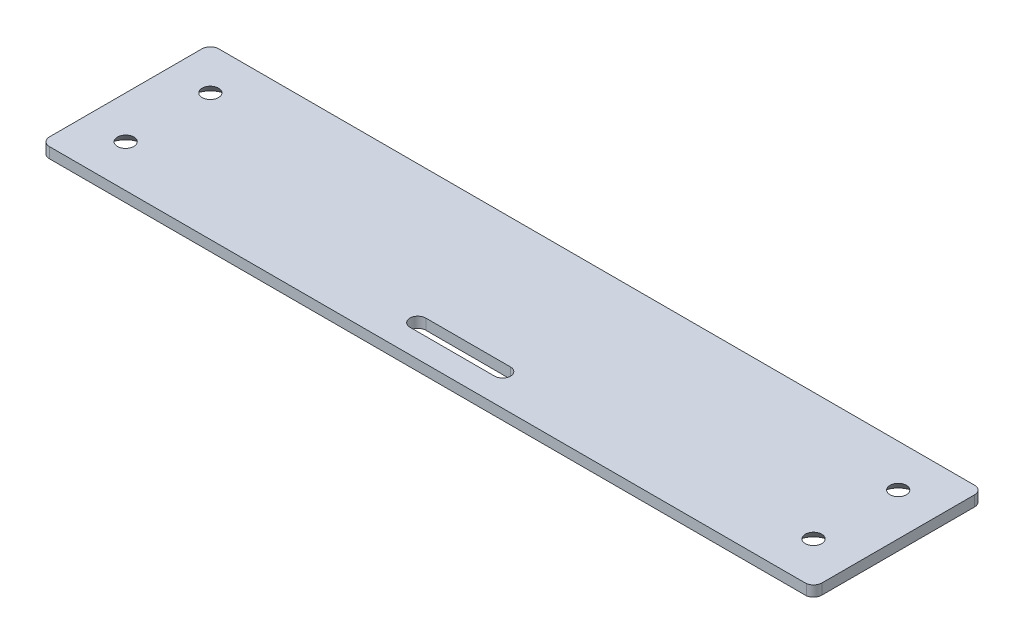
ISO-10303-21;
HEADER;
FILE_DESCRIPTION(('STEP AP214'),'2;1');
FILE_NAME('part.step','',(''),(''),'','','');
FILE_SCHEMA(('AUTOMOTIVE_DESIGN { 1 0 10303 214 1 1 1 1 }'));
ENDSEC;
DATA;
#1=APPLICATION_CONTEXT('core data for automotive mechanical design processes');
#2=APPLICATION_PROTOCOL_DEFINITION('international standard','automotive_design',2000,#1);
#3=PRODUCT_CONTEXT('',#1,'mechanical');
#4=PRODUCT('Part','Part','',(#3));
#5=PRODUCT_RELATED_PRODUCT_CATEGORY('part','',(#4));
#6=PRODUCT_DEFINITION_FORMATION('','',#4);
#7=PRODUCT_DEFINITION_CONTEXT('part definition',#1,'design');
#8=PRODUCT_DEFINITION('design','',#6,#7);
#9=PRODUCT_DEFINITION_SHAPE('','',#8);
#10=(LENGTH_UNIT() NAMED_UNIT(*) SI_UNIT(.MILLI.,.METRE.));
#11=(NAMED_UNIT(*) PLANE_ANGLE_UNIT() SI_UNIT($,.RADIAN.));
#12=(NAMED_UNIT(*) SI_UNIT($,.STERADIAN.) SOLID_ANGLE_UNIT());
#13=UNCERTAINTY_MEASURE_WITH_UNIT(LENGTH_MEASURE(1.E-05),#10,'distance_accuracy_value','');
#14=(GEOMETRIC_REPRESENTATION_CONTEXT(3) GLOBAL_UNCERTAINTY_ASSIGNED_CONTEXT((#13)) GLOBAL_UNIT_ASSIGNED_CONTEXT((#10,
#11,#12)) REPRESENTATION_CONTEXT('',''));
#15=CARTESIAN_POINT('',(0.,0.,0.));
#16=DIRECTION('',(0.,0.,1.));
#17=DIRECTION('',(1.,0.,0.));
#18=AXIS2_PLACEMENT_3D('',#15,#16,#17);
#19=CARTESIAN_POINT('',(-204.92552873815,3.175,173.764846249872));
#20=DIRECTION('',(0.,1.,0.));
#21=DIRECTION('',(0.,0.,1.));
#22=AXIS2_PLACEMENT_3D('',#19,#20,#21);
#23=PLANE('',#22);
#24=CARTESIAN_POINT('',(-103.922128749303,3.175,166.779846249872));
#25=DIRECTION('',(0.,-1.,0.));
#26=DIRECTION('',(0.,0.,-1.));
#27=AXIS2_PLACEMENT_3D('',#24,#25,#26);
#28=CIRCLE('',#27,2.38759999999999);
#29=CARTESIAN_POINT('',(-103.922128749303,3.175,169.167446249872));
#30=VERTEX_POINT('',#29);
#31=CARTESIAN_POINT('',(-103.922128749303,3.175,164.392246249872));
#32=VERTEX_POINT('',#31);
#33=EDGE_CURVE('E127',#30,#32,#28,.T.);
#34=ORIENTED_EDGE('',*,*,#33,.T.);
#35=DIRECTION('',(1.,0.,0.));
#36=VECTOR('',#35,1.);
#37=CARTESIAN_POINT('',(-103.922128749303,3.175,164.392246249872));
#38=LINE('',#37,#36);
#39=CARTESIAN_POINT('',(-78.5221287493033,3.175,164.392246249872));
#40=VERTEX_POINT('',#39);
#41=EDGE_CURVE('E136',#32,#40,#38,.T.);
#42=ORIENTED_EDGE('',*,*,#41,.T.);
#43=CARTESIAN_POINT('',(-78.5221287493033,3.175,166.779846249872));
#44=DIRECTION('',(0.,-1.,0.));
#45=DIRECTION('',(0.,0.,1.));
#46=AXIS2_PLACEMENT_3D('',#43,#44,#45);
#47=CIRCLE('',#46,2.38759999999999);
#48=CARTESIAN_POINT('',(-78.5221287493033,3.175,169.167446249872));
#49=VERTEX_POINT('',#48);
#50=EDGE_CURVE('E51',#40,#49,#47,.T.);
#51=ORIENTED_EDGE('',*,*,#50,.T.);
#52=DIRECTION('',(-1.,0.,0.));
#53=VECTOR('',#52,1.);
#54=CARTESIAN_POINT('',(-78.5221287493033,3.175,169.167446249872));
#55=LINE('',#54,#53);
#56=EDGE_CURVE('E133',#49,#30,#55,.T.);
#57=ORIENTED_EDGE('',*,*,#56,.T.);
#58=EDGE_LOOP('',(#34,#42,#51,#57));
#59=FACE_BOUND('',#58,.T.);
#60=CARTESIAN_POINT('',(11.6094712618503,3.175,163.604846249872));
#61=DIRECTION('',(0.,1.,0.));
#62=DIRECTION('',(0.,0.,1.));
#63=AXIS2_PLACEMENT_3D('',#60,#61,#62);
#64=CIRCLE('',#63,2.45971460743348);
#65=CARTESIAN_POINT('',(11.6094712618503,3.175,166.064560857305));
#66=VERTEX_POINT('',#65);
#67=EDGE_CURVE('E163',#66,#66,#64,.T.);
#68=ORIENTED_EDGE('',*,*,#67,.F.);
#69=EDGE_LOOP('',(#68));
#70=FACE_BOUND('',#69,.T.);
#71=CARTESIAN_POINT('',(-204.92552873815,3.175,173.764846249872));
#72=DIRECTION('',(0.,1.,0.));
#73=DIRECTION('',(0.,0.,1.));
#74=AXIS2_PLACEMENT_3D('',#71,#72,#73);
#75=CIRCLE('',#74,2.54);
#76=CARTESIAN_POINT('',(-207.46552873815,3.175,173.764846249872));
#77=VERTEX_POINT('',#76);
#78=CARTESIAN_POINT('',(-204.92552873815,3.175,176.304846249872));
#79=VERTEX_POINT('',#78);
#80=EDGE_CURVE('E185',#77,#79,#75,.T.);
#81=ORIENTED_EDGE('',*,*,#80,.T.);
#82=DIRECTION('',(1.,0.,0.));
#83=VECTOR('',#82,1.);
#84=CARTESIAN_POINT('',(-204.92552873815,3.175,176.304846249872));
#85=LINE('',#84,#83);
#86=CARTESIAN_POINT('',(22.1253664444665,3.175,176.304846249872));
#87=VERTEX_POINT('',#86);
#88=EDGE_CURVE('E188',#79,#87,#85,.T.);
#89=ORIENTED_EDGE('',*,*,#88,.T.);
#90=CARTESIAN_POINT('',(21.7694712618503,3.175,173.78990318511));
#91=DIRECTION('',(0.,1.,0.));
#92=DIRECTION('',(0.,0.,1.));
#93=AXIS2_PLACEMENT_3D('',#90,#91,#92);
#94=CIRCLE('',#93,2.54);
#95=CARTESIAN_POINT('',(24.3094712618503,3.175,173.78990318511));
#96=VERTEX_POINT('',#95);
#97=EDGE_CURVE('E191',#87,#96,#94,.T.);
#98=ORIENTED_EDGE('',*,*,#97,.T.);
#99=DIRECTION('',(0.,0.,-1.));
#100=VECTOR('',#99,1.);
#101=CARTESIAN_POINT('',(24.3094712618503,3.175,173.78990318511));
#102=LINE('',#101,#100);
#103=CARTESIAN_POINT('',(24.3094712618503,3.175,128.019789314633));
#104=VERTEX_POINT('',#103);
#105=EDGE_CURVE('E193',#96,#104,#102,.T.);
#106=ORIENTED_EDGE('',*,*,#105,.T.);
#107=CARTESIAN_POINT('',(21.7694712618503,3.175,128.019789314633));
#108=DIRECTION('',(0.,1.,0.));
#109=DIRECTION('',(0.,0.,-1.));
#110=AXIS2_PLACEMENT_3D('',#107,#108,#109);
#111=CIRCLE('',#110,2.54);
#112=CARTESIAN_POINT('',(22.1253664444665,3.175,125.504846249872));
#113=VERTEX_POINT('',#112);
#114=EDGE_CURVE('E195',#104,#113,#111,.T.);
#115=ORIENTED_EDGE('',*,*,#114,.T.);
#116=DIRECTION('',(-1.,0.,0.));
#117=VECTOR('',#116,1.);
#118=CARTESIAN_POINT('',(22.1253664444665,3.175,125.504846249872));
#119=LINE('',#118,#117);
#120=CARTESIAN_POINT('',(-204.92552873815,3.175,125.504846249872));
#121=VERTEX_POINT('',#120);
#122=EDGE_CURVE('E197',#113,#121,#119,.T.);
#123=ORIENTED_EDGE('',*,*,#122,.T.);
#124=CARTESIAN_POINT('',(-204.92552873815,3.175,128.044846249872));
#125=DIRECTION('',(0.,1.,0.));
#126=DIRECTION('',(0.,0.,-1.));
#127=AXIS2_PLACEMENT_3D('',#124,#125,#126);
#128=CIRCLE('',#127,2.53999999999997);
#129=CARTESIAN_POINT('',(-207.46552873815,3.175,128.044846249872));
#130=VERTEX_POINT('',#129);
#131=EDGE_CURVE('E199',#121,#130,#128,.T.);
#132=ORIENTED_EDGE('',*,*,#131,.T.);
#133=DIRECTION('',(0.,0.,1.));
#134=VECTOR('',#133,1.);
#135=CARTESIAN_POINT('',(-207.46552873815,3.175,128.044846249872));
#136=LINE('',#135,#134);
#137=EDGE_CURVE('E201',#130,#77,#136,.T.);
#138=ORIENTED_EDGE('',*,*,#137,.T.);
#139=EDGE_LOOP('',(#81,#89,#98,#106,#115,#123,#132,#138));
#140=FACE_BOUND('',#139,.T.);
#141=CARTESIAN_POINT('',(-194.76552873815,3.175,163.604846249872));
#142=DIRECTION('',(0.,1.,0.));
#143=DIRECTION('',(0.,0.,1.));
#144=AXIS2_PLACEMENT_3D('',#141,#142,#143);
#145=CIRCLE('',#144,2.45971460743348);
#146=CARTESIAN_POINT('',(-194.76552873815,3.175,166.064560857305));
#147=VERTEX_POINT('',#146);
#148=EDGE_CURVE('E181',#147,#147,#145,.T.);
#149=ORIENTED_EDGE('',*,*,#148,.F.);
#150=EDGE_LOOP('',(#149));
#151=FACE_BOUND('',#150,.T.);
#152=CARTESIAN_POINT('',(-194.76552873815,3.175,138.204846249872));
#153=DIRECTION('',(0.,1.,0.));
#154=DIRECTION('',(0.,0.,1.));
#155=AXIS2_PLACEMENT_3D('',#152,#153,#154);
#156=CIRCLE('',#155,2.45971460743348);
#157=CARTESIAN_POINT('',(-194.76552873815,3.175,140.664560857305));
#158=VERTEX_POINT('',#157);
#159=EDGE_CURVE('E175',#158,#158,#156,.T.);
#160=ORIENTED_EDGE('',*,*,#159,.F.);
#161=EDGE_LOOP('',(#160));
#162=FACE_BOUND('',#161,.T.);
#163=CARTESIAN_POINT('',(11.6094712618503,3.175,138.204846249872));
#164=DIRECTION('',(0.,1.,0.));
#165=DIRECTION('',(0.,0.,1.));
#166=AXIS2_PLACEMENT_3D('',#163,#164,#165);
#167=CIRCLE('',#166,2.45971460743348);
#168=CARTESIAN_POINT('',(11.6094712618503,3.175,140.664560857305));
#169=VERTEX_POINT('',#168);
#170=EDGE_CURVE('E169',#169,#169,#167,.T.);
#171=ORIENTED_EDGE('',*,*,#170,.F.);
#172=EDGE_LOOP('',(#171));
#173=FACE_BOUND('',#172,.T.);
#174=ADVANCED_FACE('F36',(#59,#70,#140,#151,#162,#173),#23,.T.);
#175=CARTESIAN_POINT('',(-204.92552873815,3.175,173.764846249872));
#176=DIRECTION('',(0.,-1.,0.));
#177=DIRECTION('',(0.,0.,-1.));
#178=AXIS2_PLACEMENT_3D('',#175,#176,#177);
#179=CYLINDRICAL_SURFACE('',#178,2.54);
#180=CARTESIAN_POINT('',(-204.92552873815,0.,173.764846249872));
#181=DIRECTION('',(0.,1.,0.));
#182=DIRECTION('',(0.,0.,1.));
#183=AXIS2_PLACEMENT_3D('',#180,#181,#182);
#184=CIRCLE('',#183,2.54);
#185=CARTESIAN_POINT('',(-207.46552873815,0.,173.764846249872));
#186=VERTEX_POINT('',#185);
#187=CARTESIAN_POINT('',(-204.92552873815,0.,176.304846249872));
#188=VERTEX_POINT('',#187);
#189=EDGE_CURVE('E184',#186,#188,#184,.T.);
#190=ORIENTED_EDGE('',*,*,#189,.T.);
#191=DIRECTION('',(0.,-1.,0.));
#192=VECTOR('',#191,1.);
#193=CARTESIAN_POINT('',(-204.92552873815,3.175,176.304846249872));
#194=LINE('',#193,#192);
#195=EDGE_CURVE('E11',#79,#188,#194,.T.);
#196=ORIENTED_EDGE('',*,*,#195,.F.);
#197=ORIENTED_EDGE('',*,*,#80,.F.);
#198=DIRECTION('',(0.,-1.,0.));
#199=VECTOR('',#198,1.);
#200=CARTESIAN_POINT('',(-207.46552873815,3.175,173.764846249872));
#201=LINE('',#200,#199);
#202=EDGE_CURVE('E203',#77,#186,#201,.T.);
#203=ORIENTED_EDGE('',*,*,#202,.T.);
#204=EDGE_LOOP('',(#190,#196,#197,#203));
#205=FACE_BOUND('',#204,.T.);
#206=ADVANCED_FACE('F38',(#205),#179,.T.);
#207=CARTESIAN_POINT('',(-204.92552873815,3.175,176.304846249872));
#208=DIRECTION('',(0.,0.,-1.));
#209=DIRECTION('',(-1.,0.,0.));
#210=AXIS2_PLACEMENT_3D('',#207,#208,#209);
#211=PLANE('',#210);
#212=DIRECTION('',(1.,0.,0.));
#213=VECTOR('',#212,1.);
#214=CARTESIAN_POINT('',(-204.92552873815,0.,176.304846249872));
#215=LINE('',#214,#213);
#216=CARTESIAN_POINT('',(22.1253664444665,0.,176.304846249872));
#217=VERTEX_POINT('',#216);
#218=EDGE_CURVE('E206',#188,#217,#215,.T.);
#219=ORIENTED_EDGE('',*,*,#218,.T.);
#220=DIRECTION('',(0.,-1.,0.));
#221=VECTOR('',#220,1.);
#222=CARTESIAN_POINT('',(22.1253664444665,3.175,176.304846249872));
#223=LINE('',#222,#221);
#224=EDGE_CURVE('E44',#87,#217,#223,.T.);
#225=ORIENTED_EDGE('',*,*,#224,.F.);
#226=ORIENTED_EDGE('',*,*,#88,.F.);
#227=ORIENTED_EDGE('',*,*,#195,.T.);
#228=EDGE_LOOP('',(#219,#225,#226,#227));
#229=FACE_BOUND('',#228,.T.);
#230=ADVANCED_FACE('F263',(#229),#211,.F.);
#231=CARTESIAN_POINT('',(21.7694712618503,3.175,173.78990318511));
#232=DIRECTION('',(0.,-1.,0.));
#233=DIRECTION('',(0.,0.,-1.));
#234=AXIS2_PLACEMENT_3D('',#231,#232,#233);
#235=CYLINDRICAL_SURFACE('',#234,2.54);
#236=CARTESIAN_POINT('',(21.7694712618503,0.,173.78990318511));
#237=DIRECTION('',(0.,1.,0.));
#238=DIRECTION('',(0.,0.,1.));
#239=AXIS2_PLACEMENT_3D('',#236,#237,#238);
#240=CIRCLE('',#239,2.54);
#241=CARTESIAN_POINT('',(24.3094712618503,0.,173.78990318511));
#242=VERTEX_POINT('',#241);
#243=EDGE_CURVE('E208',#217,#242,#240,.T.);
#244=ORIENTED_EDGE('',*,*,#243,.T.);
#245=DIRECTION('',(0.,-1.,0.));
#246=VECTOR('',#245,1.);
#247=CARTESIAN_POINT('',(24.3094712618503,3.175,173.78990318511));
#248=LINE('',#247,#246);
#249=EDGE_CURVE('E233',#96,#242,#248,.T.);
#250=ORIENTED_EDGE('',*,*,#249,.F.);
#251=ORIENTED_EDGE('',*,*,#97,.F.);
#252=ORIENTED_EDGE('',*,*,#224,.T.);
#253=EDGE_LOOP('',(#244,#250,#251,#252));
#254=FACE_BOUND('',#253,.T.);
#255=ADVANCED_FACE('F240',(#254),#235,.T.);
#256=CARTESIAN_POINT('',(24.3094712618503,3.175,173.78990318511));
#257=DIRECTION('',(-1.,0.,0.));
#258=DIRECTION('',(0.,0.,1.));
#259=AXIS2_PLACEMENT_3D('',#256,#257,#258);
#260=PLANE('',#259);
#261=DIRECTION('',(0.,0.,-1.));
#262=VECTOR('',#261,1.);
#263=CARTESIAN_POINT('',(24.3094712618503,0.,173.78990318511));
#264=LINE('',#263,#262);
#265=CARTESIAN_POINT('',(24.3094712618503,0.,128.019789314633));
#266=VERTEX_POINT('',#265);
#267=EDGE_CURVE('E210',#242,#266,#264,.T.);
#268=ORIENTED_EDGE('',*,*,#267,.T.);
#269=DIRECTION('',(0.,-1.,0.));
#270=VECTOR('',#269,1.);
#271=CARTESIAN_POINT('',(24.3094712618503,3.175,128.019789314633));
#272=LINE('',#271,#270);
#273=EDGE_CURVE('E230',#104,#266,#272,.T.);
#274=ORIENTED_EDGE('',*,*,#273,.F.);
#275=ORIENTED_EDGE('',*,*,#105,.F.);
#276=ORIENTED_EDGE('',*,*,#249,.T.);
#277=EDGE_LOOP('',(#268,#274,#275,#276));
#278=FACE_BOUND('',#277,.T.);
#279=ADVANCED_FACE('F251',(#278),#260,.F.);
#280=CARTESIAN_POINT('',(21.7694712618503,3.175,128.019789314633));
#281=DIRECTION('',(0.,-1.,0.));
#282=DIRECTION('',(0.,0.,-1.));
#283=AXIS2_PLACEMENT_3D('',#280,#281,#282);
#284=CYLINDRICAL_SURFACE('',#283,2.54);
#285=CARTESIAN_POINT('',(21.7694712618503,0.,128.019789314633));
#286=DIRECTION('',(0.,1.,0.));
#287=DIRECTION('',(0.,0.,-1.));
#288=AXIS2_PLACEMENT_3D('',#285,#286,#287);
#289=CIRCLE('',#288,2.54);
#290=CARTESIAN_POINT('',(22.1253664444665,0.,125.504846249872));
#291=VERTEX_POINT('',#290);
#292=EDGE_CURVE('E212',#266,#291,#289,.T.);
#293=ORIENTED_EDGE('',*,*,#292,.T.);
#294=DIRECTION('',(0.,-1.,0.));
#295=VECTOR('',#294,1.);
#296=CARTESIAN_POINT('',(22.1253664444665,3.175,125.504846249872));
#297=LINE('',#296,#295);
#298=EDGE_CURVE('E227',#113,#291,#297,.T.);
#299=ORIENTED_EDGE('',*,*,#298,.F.);
#300=ORIENTED_EDGE('',*,*,#114,.F.);
#301=ORIENTED_EDGE('',*,*,#273,.T.);
#302=EDGE_LOOP('',(#293,#299,#300,#301));
#303=FACE_BOUND('',#302,.T.);
#304=ADVANCED_FACE('F255',(#303),#284,.T.);
#305=CARTESIAN_POINT('',(22.1253664444665,3.175,125.504846249872));
#306=DIRECTION('',(0.,0.,1.));
#307=DIRECTION('',(1.,0.,0.));
#308=AXIS2_PLACEMENT_3D('',#305,#306,#307);
#309=PLANE('',#308);
#310=DIRECTION('',(-1.,0.,0.));
#311=VECTOR('',#310,1.);
#312=CARTESIAN_POINT('',(22.1253664444665,0.,125.504846249872));
#313=LINE('',#312,#311);
#314=CARTESIAN_POINT('',(-204.92552873815,0.,125.504846249872));
#315=VERTEX_POINT('',#314);
#316=EDGE_CURVE('E214',#291,#315,#313,.T.);
#317=ORIENTED_EDGE('',*,*,#316,.T.);
#318=DIRECTION('',(0.,-1.,0.));
#319=VECTOR('',#318,1.);
#320=CARTESIAN_POINT('',(-204.92552873815,3.175,125.504846249872));
#321=LINE('',#320,#319);
#322=EDGE_CURVE('E224',#121,#315,#321,.T.);
#323=ORIENTED_EDGE('',*,*,#322,.F.);
#324=ORIENTED_EDGE('',*,*,#122,.F.);
#325=ORIENTED_EDGE('',*,*,#298,.T.);
#326=EDGE_LOOP('',(#317,#323,#324,#325));
#327=FACE_BOUND('',#326,.T.);
#328=ADVANCED_FACE('F276',(#327),#309,.F.);
#329=CARTESIAN_POINT('',(-204.92552873815,3.175,128.044846249872));
#330=DIRECTION('',(0.,-1.,0.));
#331=DIRECTION('',(0.,0.,-1.));
#332=AXIS2_PLACEMENT_3D('',#329,#330,#331);
#333=CYLINDRICAL_SURFACE('',#332,2.53999999999997);
#334=CARTESIAN_POINT('',(-204.92552873815,0.,128.044846249872));
#335=DIRECTION('',(0.,1.,0.));
#336=DIRECTION('',(0.,0.,-1.));
#337=AXIS2_PLACEMENT_3D('',#334,#335,#336);
#338=CIRCLE('',#337,2.53999999999997);
#339=CARTESIAN_POINT('',(-207.46552873815,0.,128.044846249872));
#340=VERTEX_POINT('',#339);
#341=EDGE_CURVE('E216',#315,#340,#338,.T.);
#342=ORIENTED_EDGE('',*,*,#341,.T.);
#343=DIRECTION('',(0.,-1.,0.));
#344=VECTOR('',#343,1.);
#345=CARTESIAN_POINT('',(-207.46552873815,3.175,128.044846249872));
#346=LINE('',#345,#344);
#347=EDGE_CURVE('E221',#130,#340,#346,.T.);
#348=ORIENTED_EDGE('',*,*,#347,.F.);
#349=ORIENTED_EDGE('',*,*,#131,.F.);
#350=ORIENTED_EDGE('',*,*,#322,.T.);
#351=EDGE_LOOP('',(#342,#348,#349,#350));
#352=FACE_BOUND('',#351,.T.);
#353=ADVANCED_FACE('F274',(#352),#333,.T.);
#354=CARTESIAN_POINT('',(-207.46552873815,3.175,128.044846249872));
#355=DIRECTION('',(1.,0.,0.));
#356=DIRECTION('',(0.,0.,-1.));
#357=AXIS2_PLACEMENT_3D('',#354,#355,#356);
#358=PLANE('',#357);
#359=DIRECTION('',(0.,0.,1.));
#360=VECTOR('',#359,1.);
#361=CARTESIAN_POINT('',(-207.46552873815,0.,128.044846249872));
#362=LINE('',#361,#360);
#363=EDGE_CURVE('E189',#340,#186,#362,.T.);
#364=ORIENTED_EDGE('',*,*,#363,.T.);
#365=ORIENTED_EDGE('',*,*,#202,.F.);
#366=ORIENTED_EDGE('',*,*,#137,.F.);
#367=ORIENTED_EDGE('',*,*,#347,.T.);
#368=EDGE_LOOP('',(#364,#365,#366,#367));
#369=FACE_BOUND('',#368,.T.);
#370=ADVANCED_FACE('F269',(#369),#358,.F.);
#371=CARTESIAN_POINT('',(-204.92552873815,0.,173.764846249872));
#372=DIRECTION('',(0.,1.,0.));
#373=DIRECTION('',(0.,0.,1.));
#374=AXIS2_PLACEMENT_3D('',#371,#372,#373);
#375=PLANE('',#374);
#376=DIRECTION('',(1.,0.,0.));
#377=VECTOR('',#376,1.);
#378=CARTESIAN_POINT('',(-103.922128749303,0.,164.392246249872));
#379=LINE('',#378,#377);
#380=CARTESIAN_POINT('',(-103.922128749303,0.,164.392246249872));
#381=VERTEX_POINT('',#380);
#382=CARTESIAN_POINT('',(-78.5221287493033,0.,164.392246249872));
#383=VERTEX_POINT('',#382);
#384=EDGE_CURVE('E151',#381,#383,#379,.T.);
#385=ORIENTED_EDGE('',*,*,#384,.F.);
#386=CARTESIAN_POINT('',(-103.922128749303,0.,166.779846249872));
#387=DIRECTION('',(0.,-1.,0.));
#388=DIRECTION('',(0.,0.,-1.));
#389=AXIS2_PLACEMENT_3D('',#386,#387,#388);
#390=CIRCLE('',#389,2.38759999999999);
#391=CARTESIAN_POINT('',(-103.922128749303,0.,169.167446249872));
#392=VERTEX_POINT('',#391);
#393=EDGE_CURVE('E59',#392,#381,#390,.T.);
#394=ORIENTED_EDGE('',*,*,#393,.F.);
#395=DIRECTION('',(-1.,0.,0.));
#396=VECTOR('',#395,1.);
#397=CARTESIAN_POINT('',(-78.5221287493033,0.,169.167446249872));
#398=LINE('',#397,#396);
#399=CARTESIAN_POINT('',(-78.5221287493033,0.,169.167446249872));
#400=VERTEX_POINT('',#399);
#401=EDGE_CURVE('E142',#400,#392,#398,.T.);
#402=ORIENTED_EDGE('',*,*,#401,.F.);
#403=CARTESIAN_POINT('',(-78.5221287493033,0.,166.779846249872));
#404=DIRECTION('',(0.,-1.,0.));
#405=DIRECTION('',(0.,0.,1.));
#406=AXIS2_PLACEMENT_3D('',#403,#404,#405);
#407=CIRCLE('',#406,2.38759999999999);
#408=EDGE_CURVE('E145',#383,#400,#407,.T.);
#409=ORIENTED_EDGE('',*,*,#408,.F.);
#410=EDGE_LOOP('',(#385,#394,#402,#409));
#411=FACE_BOUND('',#410,.T.);
#412=CARTESIAN_POINT('',(11.6094712618503,0.,163.604846249872));
#413=DIRECTION('',(0.,-1.,0.));
#414=DIRECTION('',(0.,0.,-1.));
#415=AXIS2_PLACEMENT_3D('',#412,#413,#414);
#416=CIRCLE('',#415,5.2197);
#417=CARTESIAN_POINT('',(11.6094712618503,0.,158.385146249872));
#418=VERTEX_POINT('',#417);
#419=EDGE_CURVE('E157',#418,#418,#416,.T.);
#420=ORIENTED_EDGE('',*,*,#419,.F.);
#421=EDGE_LOOP('',(#420));
#422=FACE_BOUND('',#421,.T.);
#423=CARTESIAN_POINT('',(11.6094712618503,0.,138.204846249872));
#424=DIRECTION('',(0.,-1.,0.));
#425=DIRECTION('',(0.,0.,-1.));
#426=AXIS2_PLACEMENT_3D('',#423,#424,#425);
#427=CIRCLE('',#426,5.2197);
#428=CARTESIAN_POINT('',(11.6094712618503,0.,132.985146249872));
#429=VERTEX_POINT('',#428);
#430=EDGE_CURVE('E166',#429,#429,#427,.T.);
#431=ORIENTED_EDGE('',*,*,#430,.F.);
#432=EDGE_LOOP('',(#431));
#433=FACE_BOUND('',#432,.T.);
#434=CARTESIAN_POINT('',(-194.76552873815,0.,138.204846249872));
#435=DIRECTION('',(0.,-1.,0.));
#436=DIRECTION('',(0.,0.,-1.));
#437=AXIS2_PLACEMENT_3D('',#434,#435,#436);
#438=CIRCLE('',#437,5.21969999999999);
#439=CARTESIAN_POINT('',(-194.76552873815,0.,132.985146249872));
#440=VERTEX_POINT('',#439);
#441=EDGE_CURVE('E172',#440,#440,#438,.T.);
#442=ORIENTED_EDGE('',*,*,#441,.F.);
#443=EDGE_LOOP('',(#442));
#444=FACE_BOUND('',#443,.T.);
#445=CARTESIAN_POINT('',(-194.76552873815,0.,163.604846249872));
#446=DIRECTION('',(0.,-1.,0.));
#447=DIRECTION('',(0.,0.,-1.));
#448=AXIS2_PLACEMENT_3D('',#445,#446,#447);
#449=CIRCLE('',#448,5.21969999999999);
#450=CARTESIAN_POINT('',(-194.76552873815,0.,158.385146249872));
#451=VERTEX_POINT('',#450);
#452=EDGE_CURVE('E178',#451,#451,#449,.T.);
#453=ORIENTED_EDGE('',*,*,#452,.F.);
#454=EDGE_LOOP('',(#453));
#455=FACE_BOUND('',#454,.T.);
#456=ORIENTED_EDGE('',*,*,#189,.F.);
#457=ORIENTED_EDGE('',*,*,#363,.F.);
#458=ORIENTED_EDGE('',*,*,#341,.F.);
#459=ORIENTED_EDGE('',*,*,#316,.F.);
#460=ORIENTED_EDGE('',*,*,#292,.F.);
#461=ORIENTED_EDGE('',*,*,#267,.F.);
#462=ORIENTED_EDGE('',*,*,#243,.F.);
#463=ORIENTED_EDGE('',*,*,#218,.F.);
#464=EDGE_LOOP('',(#456,#457,#458,#459,#460,#461,#462,#463));
#465=FACE_BOUND('',#464,.T.);
#466=ADVANCED_FACE('F246',(#411,#422,#433,#444,#455,#465),#375,.F.);
#467=CARTESIAN_POINT('',(-194.76552873815,0.,163.604846249872));
#468=DIRECTION('',(0.,-1.,0.));
#469=DIRECTION('',(0.,0.,-1.));
#470=AXIS2_PLACEMENT_3D('',#467,#468,#469);
#471=CONICAL_SURFACE('',#470,5.21969999999999,0.715584993317674);
#472=ORIENTED_EDGE('',*,*,#148,.T.);
#473=EDGE_LOOP('',(#472));
#474=FACE_BOUND('',#473,.T.);
#475=ORIENTED_EDGE('',*,*,#452,.T.);
#476=EDGE_LOOP('',(#475));
#477=FACE_BOUND('',#476,.T.);
#478=ADVANCED_FACE('F292',(#474,#477),#471,.F.);
#479=CARTESIAN_POINT('',(-194.76552873815,0.,138.204846249872));
#480=DIRECTION('',(0.,-1.,0.));
#481=DIRECTION('',(0.,0.,-1.));
#482=AXIS2_PLACEMENT_3D('',#479,#480,#481);
#483=CONICAL_SURFACE('',#482,5.21969999999999,0.715584993317674);
#484=ORIENTED_EDGE('',*,*,#159,.T.);
#485=EDGE_LOOP('',(#484));
#486=FACE_BOUND('',#485,.T.);
#487=ORIENTED_EDGE('',*,*,#441,.T.);
#488=EDGE_LOOP('',(#487));
#489=FACE_BOUND('',#488,.T.);
#490=ADVANCED_FACE('F313',(#486,#489),#483,.F.);
#491=CARTESIAN_POINT('',(11.6094712618503,0.,138.204846249872));
#492=DIRECTION('',(0.,-1.,0.));
#493=DIRECTION('',(0.,0.,-1.));
#494=AXIS2_PLACEMENT_3D('',#491,#492,#493);
#495=CONICAL_SURFACE('',#494,5.2197,0.715584993317675);
#496=ORIENTED_EDGE('',*,*,#170,.T.);
#497=EDGE_LOOP('',(#496));
#498=FACE_BOUND('',#497,.T.);
#499=ORIENTED_EDGE('',*,*,#430,.T.);
#500=EDGE_LOOP('',(#499));
#501=FACE_BOUND('',#500,.T.);
#502=ADVANCED_FACE('F320',(#498,#501),#495,.F.);
#503=CARTESIAN_POINT('',(11.6094712618503,0.,163.604846249872));
#504=DIRECTION('',(0.,-1.,0.));
#505=DIRECTION('',(0.,0.,-1.));
#506=AXIS2_PLACEMENT_3D('',#503,#504,#505);
#507=CONICAL_SURFACE('',#506,5.2197,0.715584993317675);
#508=ORIENTED_EDGE('',*,*,#67,.T.);
#509=EDGE_LOOP('',(#508));
#510=FACE_BOUND('',#509,.T.);
#511=ORIENTED_EDGE('',*,*,#419,.T.);
#512=EDGE_LOOP('',(#511));
#513=FACE_BOUND('',#512,.T.);
#514=ADVANCED_FACE('F327',(#510,#513),#507,.F.);
#515=CARTESIAN_POINT('',(-103.922128749303,3.175,166.779846249872));
#516=DIRECTION('',(0.,-1.,0.));
#517=DIRECTION('',(0.,0.,-1.));
#518=AXIS2_PLACEMENT_3D('',#515,#516,#517);
#519=CYLINDRICAL_SURFACE('',#518,2.38759999999999);
#520=ORIENTED_EDGE('',*,*,#393,.T.);
#521=DIRECTION('',(0.,-1.,0.));
#522=VECTOR('',#521,1.);
#523=CARTESIAN_POINT('',(-103.922128749303,3.175,164.392246249872));
#524=LINE('',#523,#522);
#525=EDGE_CURVE('E123',#32,#381,#524,.T.);
#526=ORIENTED_EDGE('',*,*,#525,.F.);
#527=ORIENTED_EDGE('',*,*,#33,.F.);
#528=DIRECTION('',(0.,-1.,0.));
#529=VECTOR('',#528,1.);
#530=CARTESIAN_POINT('',(-103.922128749303,3.175,169.167446249872));
#531=LINE('',#530,#529);
#532=EDGE_CURVE('E155',#30,#392,#531,.T.);
#533=ORIENTED_EDGE('',*,*,#532,.T.);
#534=EDGE_LOOP('',(#520,#526,#527,#533));
#535=FACE_BOUND('',#534,.T.);
#536=ADVANCED_FACE('F125',(#535),#519,.F.);
#537=CARTESIAN_POINT('',(-78.5221287493033,3.175,169.167446249872));
#538=DIRECTION('',(0.,0.,1.));
#539=DIRECTION('',(1.,0.,0.));
#540=AXIS2_PLACEMENT_3D('',#537,#538,#539);
#541=PLANE('',#540);
#542=ORIENTED_EDGE('',*,*,#401,.T.);
#543=ORIENTED_EDGE('',*,*,#532,.F.);
#544=ORIENTED_EDGE('',*,*,#56,.F.);
#545=DIRECTION('',(0.,-1.,0.));
#546=VECTOR('',#545,1.);
#547=CARTESIAN_POINT('',(-78.5221287493033,3.175,169.167446249872));
#548=LINE('',#547,#546);
#549=EDGE_CURVE('E158',#49,#400,#548,.T.);
#550=ORIENTED_EDGE('',*,*,#549,.T.);
#551=EDGE_LOOP('',(#542,#543,#544,#550));
#552=FACE_BOUND('',#551,.T.);
#553=ADVANCED_FACE('F341',(#552),#541,.F.);
#554=CARTESIAN_POINT('',(-78.5221287493033,3.175,166.779846249872));
#555=DIRECTION('',(0.,-1.,0.));
#556=DIRECTION('',(0.,0.,-1.));
#557=AXIS2_PLACEMENT_3D('',#554,#555,#556);
#558=CYLINDRICAL_SURFACE('',#557,2.38759999999999);
#559=ORIENTED_EDGE('',*,*,#408,.T.);
#560=ORIENTED_EDGE('',*,*,#549,.F.);
#561=ORIENTED_EDGE('',*,*,#50,.F.);
#562=DIRECTION('',(0.,-1.,0.));
#563=VECTOR('',#562,1.);
#564=CARTESIAN_POINT('',(-78.5221287493033,3.175,164.392246249872));
#565=LINE('',#564,#563);
#566=EDGE_CURVE('E132',#40,#383,#565,.T.);
#567=ORIENTED_EDGE('',*,*,#566,.T.);
#568=EDGE_LOOP('',(#559,#560,#561,#567));
#569=FACE_BOUND('',#568,.T.);
#570=ADVANCED_FACE('F348',(#569),#558,.F.);
#571=CARTESIAN_POINT('',(-103.922128749303,3.175,164.392246249872));
#572=DIRECTION('',(0.,0.,-1.));
#573=DIRECTION('',(-1.,0.,0.));
#574=AXIS2_PLACEMENT_3D('',#571,#572,#573);
#575=PLANE('',#574);
#576=ORIENTED_EDGE('',*,*,#384,.T.);
#577=ORIENTED_EDGE('',*,*,#566,.F.);
#578=ORIENTED_EDGE('',*,*,#41,.F.);
#579=ORIENTED_EDGE('',*,*,#525,.T.);
#580=EDGE_LOOP('',(#576,#577,#578,#579));
#581=FACE_BOUND('',#580,.T.);
#582=ADVANCED_FACE('F137',(#581),#575,.F.);
#583=CLOSED_SHELL('',(#174,#206,#230,#255,#279,#304,#328,#353,#370,#466,#478,#490,#502,#514,
#536,#553,#570,#582));
#584=MANIFOLD_SOLID_BREP('B2',#583);
#585=ADVANCED_BREP_SHAPE_REPRESENTATION('',(#18,#584),#14);
#586=SHAPE_DEFINITION_REPRESENTATION(#9,#585);
ENDSEC;
END-ISO-10303-21;
